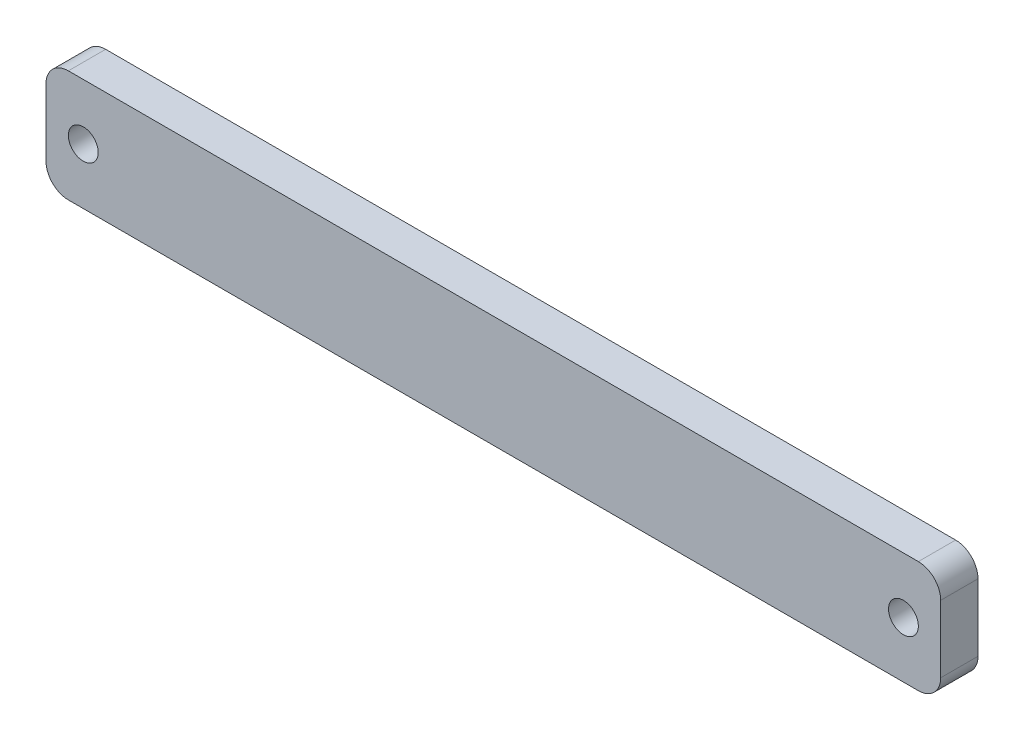
ISO-10303-21;
HEADER;
FILE_DESCRIPTION(('STEP AP214'),'2;1');
FILE_NAME('part.step','',(''),(''),'','','');
FILE_SCHEMA(('AUTOMOTIVE_DESIGN { 1 0 10303 214 1 1 1 1 }'));
ENDSEC;
DATA;
#1=APPLICATION_CONTEXT('core data for automotive mechanical design processes');
#2=APPLICATION_PROTOCOL_DEFINITION('international standard','automotive_design',2000,#1);
#3=PRODUCT_CONTEXT('',#1,'mechanical');
#4=PRODUCT('Part','Part','',(#3));
#5=PRODUCT_RELATED_PRODUCT_CATEGORY('part','',(#4));
#6=PRODUCT_DEFINITION_FORMATION('','',#4);
#7=PRODUCT_DEFINITION_CONTEXT('part definition',#1,'design');
#8=PRODUCT_DEFINITION('design','',#6,#7);
#9=PRODUCT_DEFINITION_SHAPE('','',#8);
#10=(LENGTH_UNIT() NAMED_UNIT(*) SI_UNIT(.MILLI.,.METRE.));
#11=(NAMED_UNIT(*) PLANE_ANGLE_UNIT() SI_UNIT($,.RADIAN.));
#12=(NAMED_UNIT(*) SI_UNIT($,.STERADIAN.) SOLID_ANGLE_UNIT());
#13=UNCERTAINTY_MEASURE_WITH_UNIT(LENGTH_MEASURE(1.E-05),#10,'distance_accuracy_value','');
#14=(GEOMETRIC_REPRESENTATION_CONTEXT(3) GLOBAL_UNCERTAINTY_ASSIGNED_CONTEXT((#13)) GLOBAL_UNIT_ASSIGNED_CONTEXT((#10,
#11,#12)) REPRESENTATION_CONTEXT('',''));
#15=CARTESIAN_POINT('',(0.,0.,0.));
#16=DIRECTION('',(0.,0.,1.));
#17=DIRECTION('',(1.,0.,0.));
#18=AXIS2_PLACEMENT_3D('',#15,#16,#17);
#19=CARTESIAN_POINT('',(0.,0.,5.));
#20=DIRECTION('',(0.,0.,1.));
#21=DIRECTION('',(1.,0.,0.));
#22=AXIS2_PLACEMENT_3D('',#19,#20,#21);
#23=PLANE('',#22);
#24=CARTESIAN_POINT('',(-55.,0.,5.));
#25=DIRECTION('',(0.,0.,1.));
#26=DIRECTION('',(1.,0.,0.));
#27=AXIS2_PLACEMENT_3D('',#24,#25,#26);
#28=CIRCLE('',#27,2.);
#29=CARTESIAN_POINT('',(-53.,0.,5.));
#30=VERTEX_POINT('',#29);
#31=EDGE_CURVE('E172',#30,#30,#28,.T.);
#32=ORIENTED_EDGE('',*,*,#31,.F.);
#33=EDGE_LOOP('',(#32));
#34=FACE_BOUND('',#33,.T.);
#35=DIRECTION('',(-1.,0.,0.));
#36=VECTOR('',#35,1.);
#37=CARTESIAN_POINT('',(-60.,7.5,5.));
#38=LINE('',#37,#36);
#39=CARTESIAN_POINT('',(57.,7.5,5.));
#40=VERTEX_POINT('',#39);
#41=CARTESIAN_POINT('',(-57.,7.5,5.));
#42=VERTEX_POINT('',#41);
#43=EDGE_CURVE('E167',#40,#42,#38,.T.);
#44=ORIENTED_EDGE('',*,*,#43,.T.);
#45=CARTESIAN_POINT('',(-57.,4.5,5.));
#46=DIRECTION('',(0.,0.,1.));
#47=DIRECTION('',(1.,0.,0.));
#48=AXIS2_PLACEMENT_3D('',#45,#46,#47);
#49=CIRCLE('',#48,3.);
#50=CARTESIAN_POINT('',(-60.,4.5,5.));
#51=VERTEX_POINT('',#50);
#52=EDGE_CURVE('E148',#42,#51,#49,.T.);
#53=ORIENTED_EDGE('',*,*,#52,.T.);
#54=DIRECTION('',(0.,-1.,0.));
#55=VECTOR('',#54,1.);
#56=CARTESIAN_POINT('',(-60.,7.5,5.));
#57=LINE('',#56,#55);
#58=CARTESIAN_POINT('',(-60.,-4.5,5.));
#59=VERTEX_POINT('',#58);
#60=EDGE_CURVE('E118',#51,#59,#57,.T.);
#61=ORIENTED_EDGE('',*,*,#60,.T.);
#62=CARTESIAN_POINT('',(-57.,-4.5,5.));
#63=DIRECTION('',(0.,0.,1.));
#64=DIRECTION('',(1.,0.,0.));
#65=AXIS2_PLACEMENT_3D('',#62,#63,#64);
#66=CIRCLE('',#65,3.);
#67=CARTESIAN_POINT('',(-57.,-7.5,5.));
#68=VERTEX_POINT('',#67);
#69=EDGE_CURVE('E54',#59,#68,#66,.T.);
#70=ORIENTED_EDGE('',*,*,#69,.T.);
#71=DIRECTION('',(1.,0.,0.));
#72=VECTOR('',#71,1.);
#73=CARTESIAN_POINT('',(-60.,-7.5,5.));
#74=LINE('',#73,#72);
#75=CARTESIAN_POINT('',(57.,-7.5,5.));
#76=VERTEX_POINT('',#75);
#77=EDGE_CURVE('E134',#68,#76,#74,.T.);
#78=ORIENTED_EDGE('',*,*,#77,.T.);
#79=CARTESIAN_POINT('',(57.,-4.5,5.));
#80=DIRECTION('',(0.,0.,1.));
#81=DIRECTION('',(1.,0.,0.));
#82=AXIS2_PLACEMENT_3D('',#79,#80,#81);
#83=CIRCLE('',#82,3.);
#84=CARTESIAN_POINT('',(60.,-4.5,5.));
#85=VERTEX_POINT('',#84);
#86=EDGE_CURVE('E145',#76,#85,#83,.T.);
#87=ORIENTED_EDGE('',*,*,#86,.T.);
#88=DIRECTION('',(0.,1.,0.));
#89=VECTOR('',#88,1.);
#90=CARTESIAN_POINT('',(60.,7.5,5.));
#91=LINE('',#90,#89);
#92=CARTESIAN_POINT('',(60.,4.5,5.));
#93=VERTEX_POINT('',#92);
#94=EDGE_CURVE('E128',#85,#93,#91,.T.);
#95=ORIENTED_EDGE('',*,*,#94,.T.);
#96=CARTESIAN_POINT('',(57.,4.5,5.));
#97=DIRECTION('',(0.,0.,1.));
#98=DIRECTION('',(1.,0.,0.));
#99=AXIS2_PLACEMENT_3D('',#96,#97,#98);
#100=CIRCLE('',#99,3.);
#101=EDGE_CURVE('E143',#93,#40,#100,.T.);
#102=ORIENTED_EDGE('',*,*,#101,.T.);
#103=EDGE_LOOP('',(#44,#53,#61,#70,#78,#87,#95,#102));
#104=FACE_BOUND('',#103,.T.);
#105=CARTESIAN_POINT('',(55.,0.,5.));
#106=DIRECTION('',(0.,0.,1.));
#107=DIRECTION('',(-1.,0.,0.));
#108=AXIS2_PLACEMENT_3D('',#105,#106,#107);
#109=CIRCLE('',#108,2.);
#110=CARTESIAN_POINT('',(53.,0.,5.));
#111=VERTEX_POINT('',#110);
#112=EDGE_CURVE('E181',#111,#111,#109,.T.);
#113=ORIENTED_EDGE('',*,*,#112,.F.);
#114=EDGE_LOOP('',(#113));
#115=FACE_BOUND('',#114,.T.);
#116=ADVANCED_FACE('F32',(#34,#104,#115),#23,.T.);
#117=CARTESIAN_POINT('',(0.,0.,0.));
#118=DIRECTION('',(0.,0.,1.));
#119=DIRECTION('',(1.,0.,0.));
#120=AXIS2_PLACEMENT_3D('',#117,#118,#119);
#121=PLANE('',#120);
#122=DIRECTION('',(0.,-1.,0.));
#123=VECTOR('',#122,1.);
#124=CARTESIAN_POINT('',(-60.,7.5,0.));
#125=LINE('',#124,#123);
#126=CARTESIAN_POINT('',(-60.,4.5,0.));
#127=VERTEX_POINT('',#126);
#128=CARTESIAN_POINT('',(-60.,-4.5,0.));
#129=VERTEX_POINT('',#128);
#130=EDGE_CURVE('E116',#127,#129,#125,.T.);
#131=ORIENTED_EDGE('',*,*,#130,.F.);
#132=CARTESIAN_POINT('',(-57.,4.5,0.));
#133=DIRECTION('',(0.,0.,1.));
#134=DIRECTION('',(1.,0.,0.));
#135=AXIS2_PLACEMENT_3D('',#132,#133,#134);
#136=CIRCLE('',#135,3.);
#137=CARTESIAN_POINT('',(-57.,7.5,0.));
#138=VERTEX_POINT('',#137);
#139=EDGE_CURVE('E99',#127,#138,#136,.F.);
#140=ORIENTED_EDGE('',*,*,#139,.T.);
#141=DIRECTION('',(-1.,0.,0.));
#142=VECTOR('',#141,1.);
#143=CARTESIAN_POINT('',(-60.,7.5,0.));
#144=LINE('',#143,#142);
#145=CARTESIAN_POINT('',(57.,7.5,0.));
#146=VERTEX_POINT('',#145);
#147=EDGE_CURVE('E126',#146,#138,#144,.T.);
#148=ORIENTED_EDGE('',*,*,#147,.F.);
#149=CARTESIAN_POINT('',(57.,4.5,0.));
#150=DIRECTION('',(0.,0.,1.));
#151=DIRECTION('',(1.,0.,0.));
#152=AXIS2_PLACEMENT_3D('',#149,#150,#151);
#153=CIRCLE('',#152,3.);
#154=CARTESIAN_POINT('',(60.,4.5,0.));
#155=VERTEX_POINT('',#154);
#156=EDGE_CURVE('E119',#146,#155,#153,.F.);
#157=ORIENTED_EDGE('',*,*,#156,.T.);
#158=DIRECTION('',(0.,1.,0.));
#159=VECTOR('',#158,1.);
#160=CARTESIAN_POINT('',(60.,7.5,0.));
#161=LINE('',#160,#159);
#162=CARTESIAN_POINT('',(60.,-4.5,0.));
#163=VERTEX_POINT('',#162);
#164=EDGE_CURVE('E130',#163,#155,#161,.T.);
#165=ORIENTED_EDGE('',*,*,#164,.F.);
#166=CARTESIAN_POINT('',(57.,-4.5,0.));
#167=DIRECTION('',(0.,0.,1.));
#168=DIRECTION('',(1.,0.,0.));
#169=AXIS2_PLACEMENT_3D('',#166,#167,#168);
#170=CIRCLE('',#169,3.);
#171=CARTESIAN_POINT('',(57.,-7.5,0.));
#172=VERTEX_POINT('',#171);
#173=EDGE_CURVE('E137',#163,#172,#170,.F.);
#174=ORIENTED_EDGE('',*,*,#173,.T.);
#175=DIRECTION('',(1.,0.,0.));
#176=VECTOR('',#175,1.);
#177=CARTESIAN_POINT('',(-60.,-7.5,0.));
#178=LINE('',#177,#176);
#179=CARTESIAN_POINT('',(-57.,-7.5,0.));
#180=VERTEX_POINT('',#179);
#181=EDGE_CURVE('E125',#180,#172,#178,.T.);
#182=ORIENTED_EDGE('',*,*,#181,.F.);
#183=CARTESIAN_POINT('',(-57.,-4.5,0.));
#184=DIRECTION('',(0.,0.,1.));
#185=DIRECTION('',(1.,0.,0.));
#186=AXIS2_PLACEMENT_3D('',#183,#184,#185);
#187=CIRCLE('',#186,3.);
#188=EDGE_CURVE('E110',#180,#129,#187,.F.);
#189=ORIENTED_EDGE('',*,*,#188,.T.);
#190=EDGE_LOOP('',(#131,#140,#148,#157,#165,#174,#182,#189));
#191=FACE_BOUND('',#190,.T.);
#192=CARTESIAN_POINT('',(-55.,0.,0.));
#193=DIRECTION('',(0.,0.,1.));
#194=DIRECTION('',(1.,0.,0.));
#195=AXIS2_PLACEMENT_3D('',#192,#193,#194);
#196=CIRCLE('',#195,2.);
#197=CARTESIAN_POINT('',(-53.,0.,0.));
#198=VERTEX_POINT('',#197);
#199=EDGE_CURVE('E174',#198,#198,#196,.T.);
#200=ORIENTED_EDGE('',*,*,#199,.T.);
#201=EDGE_LOOP('',(#200));
#202=FACE_BOUND('',#201,.T.);
#203=CARTESIAN_POINT('',(55.,0.,0.));
#204=DIRECTION('',(0.,0.,1.));
#205=DIRECTION('',(-1.,0.,0.));
#206=AXIS2_PLACEMENT_3D('',#203,#204,#205);
#207=CIRCLE('',#206,2.);
#208=CARTESIAN_POINT('',(53.,0.,0.));
#209=VERTEX_POINT('',#208);
#210=EDGE_CURVE('E183',#209,#209,#207,.T.);
#211=ORIENTED_EDGE('',*,*,#210,.T.);
#212=EDGE_LOOP('',(#211));
#213=FACE_BOUND('',#212,.T.);
#214=ADVANCED_FACE('F122',(#191,#202,#213),#121,.F.);
#215=CARTESIAN_POINT('',(60.,7.5,5.));
#216=DIRECTION('',(-1.,0.,0.));
#217=DIRECTION('',(0.,0.,1.));
#218=AXIS2_PLACEMENT_3D('',#215,#216,#217);
#219=PLANE('',#218);
#220=ORIENTED_EDGE('',*,*,#94,.F.);
#221=DIRECTION('',(0.,0.,-1.));
#222=VECTOR('',#221,1.);
#223=CARTESIAN_POINT('',(60.,-4.5,5.));
#224=LINE('',#223,#222);
#225=EDGE_CURVE('E11',#85,#163,#224,.T.);
#226=ORIENTED_EDGE('',*,*,#225,.T.);
#227=ORIENTED_EDGE('',*,*,#164,.T.);
#228=DIRECTION('',(0.,0.,-1.));
#229=VECTOR('',#228,1.);
#230=CARTESIAN_POINT('',(60.,4.5,5.));
#231=LINE('',#230,#229);
#232=EDGE_CURVE('E40',#155,#93,#231,.F.);
#233=ORIENTED_EDGE('',*,*,#232,.T.);
#234=EDGE_LOOP('',(#220,#226,#227,#233));
#235=FACE_BOUND('',#234,.T.);
#236=ADVANCED_FACE('F158',(#235),#219,.F.);
#237=CARTESIAN_POINT('',(-60.,7.5,5.));
#238=DIRECTION('',(0.,-1.,0.));
#239=DIRECTION('',(0.,0.,-1.));
#240=AXIS2_PLACEMENT_3D('',#237,#238,#239);
#241=PLANE('',#240);
#242=ORIENTED_EDGE('',*,*,#147,.T.);
#243=DIRECTION('',(0.,0.,-1.));
#244=VECTOR('',#243,1.);
#245=CARTESIAN_POINT('',(-57.,7.5,5.));
#246=LINE('',#245,#244);
#247=EDGE_CURVE('E104',#138,#42,#246,.F.);
#248=ORIENTED_EDGE('',*,*,#247,.T.);
#249=ORIENTED_EDGE('',*,*,#43,.F.);
#250=DIRECTION('',(0.,0.,-1.));
#251=VECTOR('',#250,1.);
#252=CARTESIAN_POINT('',(57.,7.5,5.));
#253=LINE('',#252,#251);
#254=EDGE_CURVE('E109',#40,#146,#253,.T.);
#255=ORIENTED_EDGE('',*,*,#254,.T.);
#256=EDGE_LOOP('',(#242,#248,#249,#255));
#257=FACE_BOUND('',#256,.T.);
#258=ADVANCED_FACE('F171',(#257),#241,.F.);
#259=CARTESIAN_POINT('',(-60.,7.5,5.));
#260=DIRECTION('',(1.,0.,0.));
#261=DIRECTION('',(0.,0.,-1.));
#262=AXIS2_PLACEMENT_3D('',#259,#260,#261);
#263=PLANE('',#262);
#264=ORIENTED_EDGE('',*,*,#60,.F.);
#265=DIRECTION('',(0.,0.,-1.));
#266=VECTOR('',#265,1.);
#267=CARTESIAN_POINT('',(-60.,4.5,5.));
#268=LINE('',#267,#266);
#269=EDGE_CURVE('E103',#51,#127,#268,.T.);
#270=ORIENTED_EDGE('',*,*,#269,.T.);
#271=ORIENTED_EDGE('',*,*,#130,.T.);
#272=DIRECTION('',(0.,0.,-1.));
#273=VECTOR('',#272,1.);
#274=CARTESIAN_POINT('',(-60.,-4.5,5.));
#275=LINE('',#274,#273);
#276=EDGE_CURVE('E120',#129,#59,#275,.F.);
#277=ORIENTED_EDGE('',*,*,#276,.T.);
#278=EDGE_LOOP('',(#264,#270,#271,#277));
#279=FACE_BOUND('',#278,.T.);
#280=ADVANCED_FACE('F115',(#279),#263,.F.);
#281=CARTESIAN_POINT('',(-60.,-7.5,5.));
#282=DIRECTION('',(0.,1.,0.));
#283=DIRECTION('',(0.,0.,1.));
#284=AXIS2_PLACEMENT_3D('',#281,#282,#283);
#285=PLANE('',#284);
#286=ORIENTED_EDGE('',*,*,#77,.F.);
#287=DIRECTION('',(0.,0.,-1.));
#288=VECTOR('',#287,1.);
#289=CARTESIAN_POINT('',(-57.,-7.5,5.));
#290=LINE('',#289,#288);
#291=EDGE_CURVE('E151',#68,#180,#290,.T.);
#292=ORIENTED_EDGE('',*,*,#291,.T.);
#293=ORIENTED_EDGE('',*,*,#181,.T.);
#294=DIRECTION('',(0.,0.,-1.));
#295=VECTOR('',#294,1.);
#296=CARTESIAN_POINT('',(57.,-7.5,5.));
#297=LINE('',#296,#295);
#298=EDGE_CURVE('E47',#172,#76,#297,.F.);
#299=ORIENTED_EDGE('',*,*,#298,.T.);
#300=EDGE_LOOP('',(#286,#292,#293,#299));
#301=FACE_BOUND('',#300,.T.);
#302=ADVANCED_FACE('F203',(#301),#285,.F.);
#303=CARTESIAN_POINT('',(-55.,0.,5.));
#304=DIRECTION('',(0.,0.,-1.));
#305=DIRECTION('',(-1.,0.,0.));
#306=AXIS2_PLACEMENT_3D('',#303,#304,#305);
#307=CYLINDRICAL_SURFACE('',#306,2.);
#308=ORIENTED_EDGE('',*,*,#31,.T.);
#309=EDGE_LOOP('',(#308));
#310=FACE_BOUND('',#309,.T.);
#311=ORIENTED_EDGE('',*,*,#199,.F.);
#312=EDGE_LOOP('',(#311));
#313=FACE_BOUND('',#312,.T.);
#314=ADVANCED_FACE('F200',(#310,#313),#307,.F.);
#315=CARTESIAN_POINT('',(55.,0.,5.));
#316=DIRECTION('',(0.,0.,-1.));
#317=DIRECTION('',(-1.,0.,0.));
#318=AXIS2_PLACEMENT_3D('',#315,#316,#317);
#319=CYLINDRICAL_SURFACE('',#318,2.);
#320=ORIENTED_EDGE('',*,*,#112,.T.);
#321=EDGE_LOOP('',(#320));
#322=FACE_BOUND('',#321,.T.);
#323=ORIENTED_EDGE('',*,*,#210,.F.);
#324=EDGE_LOOP('',(#323));
#325=FACE_BOUND('',#324,.T.);
#326=ADVANCED_FACE('F189',(#322,#325),#319,.F.);
#327=CARTESIAN_POINT('',(-57.,4.5,5.));
#328=DIRECTION('',(0.,0.,-1.));
#329=DIRECTION('',(-1.,0.,0.));
#330=AXIS2_PLACEMENT_3D('',#327,#328,#329);
#331=CYLINDRICAL_SURFACE('',#330,3.);
#332=ORIENTED_EDGE('',*,*,#52,.F.);
#333=ORIENTED_EDGE('',*,*,#247,.F.);
#334=ORIENTED_EDGE('',*,*,#139,.F.);
#335=ORIENTED_EDGE('',*,*,#269,.F.);
#336=EDGE_LOOP('',(#332,#333,#334,#335));
#337=FACE_BOUND('',#336,.T.);
#338=ADVANCED_FACE('F102',(#337),#331,.T.);
#339=CARTESIAN_POINT('',(-57.,-4.5,5.));
#340=DIRECTION('',(0.,0.,-1.));
#341=DIRECTION('',(-1.,0.,0.));
#342=AXIS2_PLACEMENT_3D('',#339,#340,#341);
#343=CYLINDRICAL_SURFACE('',#342,3.);
#344=ORIENTED_EDGE('',*,*,#69,.F.);
#345=ORIENTED_EDGE('',*,*,#276,.F.);
#346=ORIENTED_EDGE('',*,*,#188,.F.);
#347=ORIENTED_EDGE('',*,*,#291,.F.);
#348=EDGE_LOOP('',(#344,#345,#346,#347));
#349=FACE_BOUND('',#348,.T.);
#350=ADVANCED_FACE('F214',(#349),#343,.T.);
#351=CARTESIAN_POINT('',(57.,-4.5,5.));
#352=DIRECTION('',(0.,0.,-1.));
#353=DIRECTION('',(-1.,0.,0.));
#354=AXIS2_PLACEMENT_3D('',#351,#352,#353);
#355=CYLINDRICAL_SURFACE('',#354,3.);
#356=ORIENTED_EDGE('',*,*,#86,.F.);
#357=ORIENTED_EDGE('',*,*,#298,.F.);
#358=ORIENTED_EDGE('',*,*,#173,.F.);
#359=ORIENTED_EDGE('',*,*,#225,.F.);
#360=EDGE_LOOP('',(#356,#357,#358,#359));
#361=FACE_BOUND('',#360,.T.);
#362=ADVANCED_FACE('F216',(#361),#355,.T.);
#363=CARTESIAN_POINT('',(57.,4.5,5.));
#364=DIRECTION('',(0.,0.,-1.));
#365=DIRECTION('',(-1.,0.,0.));
#366=AXIS2_PLACEMENT_3D('',#363,#364,#365);
#367=CYLINDRICAL_SURFACE('',#366,3.);
#368=ORIENTED_EDGE('',*,*,#101,.F.);
#369=ORIENTED_EDGE('',*,*,#232,.F.);
#370=ORIENTED_EDGE('',*,*,#156,.F.);
#371=ORIENTED_EDGE('',*,*,#254,.F.);
#372=EDGE_LOOP('',(#368,#369,#370,#371));
#373=FACE_BOUND('',#372,.T.);
#374=ADVANCED_FACE('F34',(#373),#367,.T.);
#375=CLOSED_SHELL('',(#116,#214,#236,#258,#280,#302,#314,#326,#338,#350,#362,#374));
#376=MANIFOLD_SOLID_BREP('B2',#375);
#377=ADVANCED_BREP_SHAPE_REPRESENTATION('',(#18,#376),#14);
#378=SHAPE_DEFINITION_REPRESENTATION(#9,#377);
ENDSEC;
END-ISO-10303-21;
